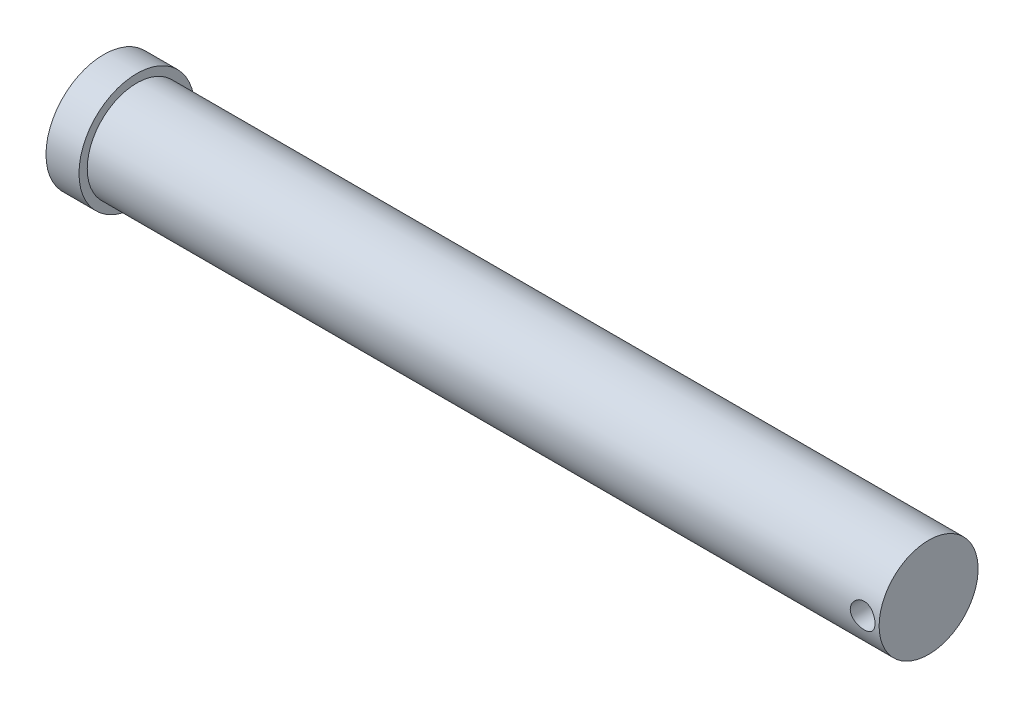
ISO-10303-21;
HEADER;
FILE_DESCRIPTION(('STEP AP214'),'2;1');
FILE_NAME('part.step','',(''),(''),'','','');
FILE_SCHEMA(('AUTOMOTIVE_DESIGN { 1 0 10303 214 1 1 1 1 }'));
ENDSEC;
DATA;
#1=APPLICATION_CONTEXT('core data for automotive mechanical design processes');
#2=APPLICATION_PROTOCOL_DEFINITION('international standard','automotive_design',2000,#1);
#3=PRODUCT_CONTEXT('',#1,'mechanical');
#4=PRODUCT('Part','Part','',(#3));
#5=PRODUCT_RELATED_PRODUCT_CATEGORY('part','',(#4));
#6=PRODUCT_DEFINITION_FORMATION('','',#4);
#7=PRODUCT_DEFINITION_CONTEXT('part definition',#1,'design');
#8=PRODUCT_DEFINITION('design','',#6,#7);
#9=PRODUCT_DEFINITION_SHAPE('','',#8);
#10=(LENGTH_UNIT() NAMED_UNIT(*) SI_UNIT(.MILLI.,.METRE.));
#11=(NAMED_UNIT(*) PLANE_ANGLE_UNIT() SI_UNIT($,.RADIAN.));
#12=(NAMED_UNIT(*) SI_UNIT($,.STERADIAN.) SOLID_ANGLE_UNIT());
#13=UNCERTAINTY_MEASURE_WITH_UNIT(LENGTH_MEASURE(1.E-05),#10,'distance_accuracy_value','');
#14=(GEOMETRIC_REPRESENTATION_CONTEXT(3) GLOBAL_UNCERTAINTY_ASSIGNED_CONTEXT((#13)) GLOBAL_UNIT_ASSIGNED_CONTEXT((#10,
#11,#12)) REPRESENTATION_CONTEXT('',''));
#15=CARTESIAN_POINT('',(0.,0.,0.));
#16=DIRECTION('',(0.,0.,1.));
#17=DIRECTION('',(1.,0.,0.));
#18=AXIS2_PLACEMENT_3D('',#15,#16,#17);
#19=CARTESIAN_POINT('',(0.,0.,0.));
#20=DIRECTION('',(1.,0.,0.));
#21=DIRECTION('',(0.,0.,-1.));
#22=AXIS2_PLACEMENT_3D('',#19,#20,#21);
#23=PLANE('',#22);
#24=CARTESIAN_POINT('',(0.,0.,0.));
#25=DIRECTION('',(-1.,0.,0.));
#26=DIRECTION('',(0.,0.,1.));
#27=AXIS2_PLACEMENT_3D('',#24,#25,#26);
#28=CIRCLE('',#27,35.);
#29=CARTESIAN_POINT('',(0.,0.,35.));
#30=VERTEX_POINT('',#29);
#31=EDGE_CURVE('E45',#30,#30,#28,.T.);
#32=ORIENTED_EDGE('',*,*,#31,.T.);
#33=EDGE_LOOP('',(#32));
#34=FACE_BOUND('',#33,.T.);
#35=ADVANCED_FACE('F30',(#34),#23,.F.);
#36=CARTESIAN_POINT('',(0.,0.,0.));
#37=DIRECTION('',(-1.,0.,0.));
#38=DIRECTION('',(0.,0.,1.));
#39=AXIS2_PLACEMENT_3D('',#36,#37,#38);
#40=CYLINDRICAL_SURFACE('',#39,35.);
#41=ORIENTED_EDGE('',*,*,#31,.F.);
#42=EDGE_LOOP('',(#41));
#43=FACE_BOUND('',#42,.T.);
#44=CARTESIAN_POINT('',(20.,0.,0.));
#45=DIRECTION('',(-1.,0.,0.));
#46=DIRECTION('',(0.,0.,1.));
#47=AXIS2_PLACEMENT_3D('',#44,#45,#46);
#48=CIRCLE('',#47,35.);
#49=CARTESIAN_POINT('',(20.,0.,35.));
#50=VERTEX_POINT('',#49);
#51=EDGE_CURVE('E49',#50,#50,#48,.T.);
#52=ORIENTED_EDGE('',*,*,#51,.T.);
#53=EDGE_LOOP('',(#52));
#54=FACE_BOUND('',#53,.T.);
#55=ADVANCED_FACE('F73',(#43,#54),#40,.T.);
#56=CARTESIAN_POINT('',(20.,35.,0.));
#57=DIRECTION('',(-1.,0.,0.));
#58=DIRECTION('',(0.,0.,1.));
#59=AXIS2_PLACEMENT_3D('',#56,#57,#58);
#60=PLANE('',#59);
#61=ORIENTED_EDGE('',*,*,#51,.F.);
#62=EDGE_LOOP('',(#61));
#63=FACE_BOUND('',#62,.T.);
#64=CARTESIAN_POINT('',(20.,0.,0.));
#65=DIRECTION('',(-1.,0.,0.));
#66=DIRECTION('',(0.,0.,1.));
#67=AXIS2_PLACEMENT_3D('',#64,#65,#66);
#68=CIRCLE('',#67,30.);
#69=CARTESIAN_POINT('',(20.,0.,30.));
#70=VERTEX_POINT('',#69);
#71=EDGE_CURVE('E84',#70,#70,#68,.T.);
#72=ORIENTED_EDGE('',*,*,#71,.T.);
#73=EDGE_LOOP('',(#72));
#74=FACE_BOUND('',#73,.T.);
#75=ADVANCED_FACE('F70',(#63,#74),#60,.F.);
#76=CARTESIAN_POINT('',(0.,0.,0.));
#77=DIRECTION('',(-1.,0.,0.));
#78=DIRECTION('',(0.,0.,1.));
#79=AXIS2_PLACEMENT_3D('',#76,#77,#78);
#80=CYLINDRICAL_SURFACE('',#79,30.);
#81=CARTESIAN_POINT('',(497.5,0.,-30.));
#82=CARTESIAN_POINT('',(497.500006186217,0.207256734254574,-30.0000037453459));
#83=CARTESIAN_POINT('',(497.491407656385,0.414445772619032,-29.9978490421554));
#84=CARTESIAN_POINT('',(497.457100172479,0.827372926875369,-29.9892986338407));
#85=CARTESIAN_POINT('',(497.431389266198,1.0331108745179,-29.9829024448411));
#86=CARTESIAN_POINT('',(497.36305535088,1.44164335288554,-29.9660390935064));
#87=CARTESIAN_POINT('',(497.320427095302,1.6444369502421,-29.9555706682773));
#88=CARTESIAN_POINT('',(497.218595090544,2.04566249050755,-29.9308482104685));
#89=CARTESIAN_POINT('',(497.159385232191,2.2440927967297,-29.9165927827403));
#90=CARTESIAN_POINT('',(497.024978510783,2.63482361033414,-29.8847130121074));
#91=CARTESIAN_POINT('',(496.949807291118,2.82713338772061,-29.8670940775137));
#92=CARTESIAN_POINT('',(496.783968260347,3.20473275040713,-29.8289408904844));
#93=CARTESIAN_POINT('',(496.693294723878,3.39001971101988,-29.8084055614329));
#94=CARTESIAN_POINT('',(496.497171832667,3.75222027556639,-29.7649811811595));
#95=CARTESIAN_POINT('',(496.391727896132,3.92913691827915,-29.742092993849));
#96=CARTESIAN_POINT('',(496.166735936979,4.27360568159023,-29.6945540671174));
#97=CARTESIAN_POINT('',(496.047182537647,4.44115419618484,-29.6699026572012));
#98=CARTESIAN_POINT('',(495.792523081933,4.76869838853698,-29.619039181262));
#99=CARTESIAN_POINT('',(495.657174907785,4.92850273427093,-29.5928069564233));
#100=CARTESIAN_POINT('',(495.373571351917,5.23627158512015,-29.5399027992388));
#101=CARTESIAN_POINT('',(495.225310108958,5.38423065457484,-29.5132306717209));
#102=CARTESIAN_POINT('',(494.916888160703,5.66727667516601,-29.4601886439759));
#103=CARTESIAN_POINT('',(494.756726097413,5.80236215327963,-29.4338187786372));
#104=CARTESIAN_POINT('',(494.425632772002,6.05867850940972,-29.3821290110363));
#105=CARTESIAN_POINT('',(494.254706399365,6.1799156083703,-29.3568086406046));
#106=CARTESIAN_POINT('',(493.900431237845,6.40951409930151,-29.3075439341613));
#107=CARTESIAN_POINT('',(493.716932176899,6.51764960185278,-29.2836266449605));
#108=CARTESIAN_POINT('',(493.341230118986,6.71799715274033,-29.2383150093389));
#109=CARTESIAN_POINT('',(493.149030545994,6.81021539751506,-29.2169196821753));
#110=CARTESIAN_POINT('',(492.757145068966,6.97807998690056,-29.1772830300449));
#111=CARTESIAN_POINT('',(492.557457135497,7.05372180053082,-29.1590425677112));
#112=CARTESIAN_POINT('',(492.152161449931,7.18774907819539,-29.1262944152227));
#113=CARTESIAN_POINT('',(491.946556194448,7.24614170611684,-29.111785175751));
#114=CARTESIAN_POINT('',(491.534958657447,7.34423429783448,-29.087191868454));
#115=CARTESIAN_POINT('',(491.329053396646,7.3842790777465,-29.0770264361312));
#116=CARTESIAN_POINT('',(490.914524296797,7.44698381998103,-29.0610302983691));
#117=CARTESIAN_POINT('',(490.705901540208,7.46965050140471,-29.0551979176174));
#118=CARTESIAN_POINT('',(490.287403528923,7.4974248655388,-29.0480434288025));
#119=CARTESIAN_POINT('',(490.077528217797,7.50253175108483,-29.0467215255021));
#120=CARTESIAN_POINT('',(489.658110384037,7.49513850303138,-29.0486301556068));
#121=CARTESIAN_POINT('',(489.448567856817,7.48263861425262,-29.0518606257116));
#122=CARTESIAN_POINT('',(489.036489209476,7.44066443989573,-29.0626386537169));
#123=CARTESIAN_POINT('',(488.833907059313,7.4116127135399,-29.0700787116682));
#124=CARTESIAN_POINT('',(488.431905166734,7.33708950806225,-29.0889771849314));
#125=CARTESIAN_POINT('',(488.232486535232,7.29161238858818,-29.1004369805509));
#126=CARTESIAN_POINT('',(487.838319690164,7.18462456321622,-29.1270356051467));
#127=CARTESIAN_POINT('',(487.643570038699,7.12311886472078,-29.1421732850352));
#128=CARTESIAN_POINT('',(487.259908488116,6.98451980658927,-29.1757016001342));
#129=CARTESIAN_POINT('',(487.070998807608,6.90742060486374,-29.1940934541936));
#130=CARTESIAN_POINT('',(486.69851839304,6.73739848582151,-29.2338015327733));
#131=CARTESIAN_POINT('',(486.515017414975,6.64432902465888,-29.2551444484012));
#132=CARTESIAN_POINT('',(486.156419006921,6.44353389820847,-29.3000247863839));
#133=CARTESIAN_POINT('',(485.981324498637,6.33580318651136,-29.3235629634671));
#134=CARTESIAN_POINT('',(485.640714884194,6.10645448231138,-29.3721798477543));
#135=CARTESIAN_POINT('',(485.475199544114,5.98483682913734,-29.3972585173093));
#136=CARTESIAN_POINT('',(485.154773921606,5.72851464458563,-29.4482799478748));
#137=CARTESIAN_POINT('',(484.999863844413,5.59380986006436,-29.4742227255933));
#138=CARTESIAN_POINT('',(484.697330574703,5.30812720402336,-29.5270296746379));
#139=CARTESIAN_POINT('',(484.550044476872,5.15679305825285,-29.5538989083984));
#140=CARTESIAN_POINT('',(484.268755446213,4.8422451377086,-29.6070614891839));
#141=CARTESIAN_POINT('',(484.134748122933,4.67903532063278,-29.633355024301));
#142=CARTESIAN_POINT('',(483.88082948277,4.34169745900449,-29.6846555639648));
#143=CARTESIAN_POINT('',(483.760923905518,4.16756501268236,-29.7096620423464));
#144=CARTESIAN_POINT('',(483.536173056712,3.80966849400542,-29.7576713903058));
#145=CARTESIAN_POINT('',(483.431321967214,3.62590818010508,-29.7806750325377));
#146=CARTESIAN_POINT('',(483.237034272838,3.24921184124929,-29.8241295151946));
#147=CARTESIAN_POINT('',(483.147658542865,3.05624322556215,-29.8445701905708));
#148=CARTESIAN_POINT('',(482.985552498738,2.6632116427314,-29.8822063507743));
#149=CARTESIAN_POINT('',(482.912816015972,2.46315133653782,-29.8994030378182));
#150=CARTESIAN_POINT('',(482.784544100766,2.05730133669797,-29.9300671893901));
#151=CARTESIAN_POINT('',(482.729009232108,1.85151145550624,-29.9435345316876));
#152=CARTESIAN_POINT('',(482.635622134414,1.43573434643275,-29.9663479171876));
#153=CARTESIAN_POINT('',(482.597769469432,1.22574722216535,-29.9756940619961));
#154=CARTESIAN_POINT('',(482.540819163691,0.808578683807361,-29.9898089145492));
#155=CARTESIAN_POINT('',(482.521266127366,0.601463095698461,-29.9946886976466));
#156=CARTESIAN_POINT('',(482.499432162322,0.186267995157771,-30.0001400772457));
#157=CARTESIAN_POINT('',(482.497150960436,-0.0218115019769025,-30.000711741884));
#158=CARTESIAN_POINT('',(482.50987953381,-0.437389325214032,-29.9975310207239));
#159=CARTESIAN_POINT('',(482.524887864681,-0.644887698412749,-29.9937789961322));
#160=CARTESIAN_POINT('',(482.572063941794,-1.05780268491358,-29.9820565166686));
#161=CARTESIAN_POINT('',(482.604231620946,-1.26321930635195,-29.9740860782903));
#162=CARTESIAN_POINT('',(482.684842366611,-1.66742320422338,-29.9542990466074));
#163=CARTESIAN_POINT('',(482.733033584068,-1.86626371494321,-29.9425420528386));
#164=CARTESIAN_POINT('',(482.845432070167,-2.25918742632009,-29.9154620308896));
#165=CARTESIAN_POINT('',(482.909644760804,-2.45326899198191,-29.9001377955995));
#166=CARTESIAN_POINT('',(483.05356225007,-2.83525089394273,-29.8663374011303));
#167=CARTESIAN_POINT('',(483.133262697368,-3.02315294909719,-29.8478621274231));
#168=CARTESIAN_POINT('',(483.307610064188,-3.39167896910059,-29.8082350586212));
#169=CARTESIAN_POINT('',(483.402262583514,-3.57230017520982,-29.7870822613409));
#170=CARTESIAN_POINT('',(483.607595070583,-3.92811410360474,-29.7422701230095));
#171=CARTESIAN_POINT('',(483.718525064136,-4.10315786453239,-29.7185735994032));
#172=CARTESIAN_POINT('',(483.954405866344,-4.44338343365202,-29.6696123625192));
#173=CARTESIAN_POINT('',(484.07936153279,-4.60856179442647,-29.6443471072734));
#174=CARTESIAN_POINT('',(484.342420940197,-4.92794065130355,-29.5929310301235));
#175=CARTESIAN_POINT('',(484.480524460526,-5.08214133154532,-29.5667802230845));
#176=CARTESIAN_POINT('',(484.76898239741,-5.37858986672454,-29.5142920657744));
#177=CARTESIAN_POINT('',(484.919336952682,-5.52083758628274,-29.4879547133943));
#178=CARTESIAN_POINT('',(485.235205576479,-5.79583124003958,-29.4351563606738));
#179=CARTESIAN_POINT('',(485.401002867936,-5.92825459803295,-29.4087084526847));
#180=CARTESIAN_POINT('',(485.743293990939,-6.17862451598173,-29.3571275246933));
#181=CARTESIAN_POINT('',(485.919784122681,-6.2965760410501,-29.3319940554304));
#182=CARTESIAN_POINT('',(486.282397387657,-6.51724566861915,-29.2837544538572));
#183=CARTESIAN_POINT('',(486.468523885388,-6.61995840151206,-29.2606490373261));
#184=CARTESIAN_POINT('',(486.849007741884,-6.80928641924752,-29.2171705487862));
#185=CARTESIAN_POINT('',(487.043361767825,-6.89590814708463,-29.1967963840713));
#186=CARTESIAN_POINT('',(487.437897915295,-7.05197723932849,-29.1594928518965));
#187=CARTESIAN_POINT('',(487.638041174236,-7.12151832737373,-29.142544780169));
#188=CARTESIAN_POINT('',(488.043683954083,-7.24345651216679,-29.1124764442986));
#189=CARTESIAN_POINT('',(488.249181379846,-7.29586020933087,-29.0993547066657));
#190=CARTESIAN_POINT('',(488.664097517061,-7.38310953761381,-29.0773403452908));
#191=CARTESIAN_POINT('',(488.873516262,-7.41795501871784,-29.0684477576821));
#192=CARTESIAN_POINT('',(489.294693502206,-7.46977632397466,-29.0551744235845));
#193=CARTESIAN_POINT('',(489.506451941057,-7.48675257805307,-29.0507935685455));
#194=CARTESIAN_POINT('',(489.924548037895,-7.50245275501608,-29.0467427280977));
#195=CARTESIAN_POINT('',(490.130865291879,-7.50169050219219,-29.0469401256905));
#196=CARTESIAN_POINT('',(490.542757585411,-7.48317627143568,-29.0517153474306));
#197=CARTESIAN_POINT('',(490.748332344452,-7.46541843430738,-29.0562946822425));
#198=CARTESIAN_POINT('',(491.157102212016,-7.41306667528967,-29.0696950370366));
#199=CARTESIAN_POINT('',(491.360298223325,-7.37847936764756,-29.0785143906083));
#200=CARTESIAN_POINT('',(491.763027411306,-7.29274542738182,-29.1001342961677));
#201=CARTESIAN_POINT('',(491.962559195749,-7.24159263281379,-29.1129363295422));
#202=CARTESIAN_POINT('',(492.355248099114,-7.12352281554545,-29.1420502241293));
#203=CARTESIAN_POINT('',(492.548437627675,-7.05670785633591,-29.1583393045388));
#204=CARTESIAN_POINT('',(492.928538990651,-6.90762983393257,-29.1940151713161));
#205=CARTESIAN_POINT('',(493.115448654799,-6.82536149362097,-29.2134030155311));
#206=CARTESIAN_POINT('',(493.481700975957,-6.64600134575065,-29.2547283332099));
#207=CARTESIAN_POINT('',(493.66104416923,-6.54891059096671,-29.2766656255706));
#208=CARTESIAN_POINT('',(494.011053726098,-6.34057791264133,-29.3224903932774));
#209=CARTESIAN_POINT('',(494.181719851362,-6.2293356006946,-29.3463779221434));
#210=CARTESIAN_POINT('',(494.517676511658,-5.99034243964055,-29.3961065190916));
#211=CARTESIAN_POINT('',(494.682708134733,-5.86223474325166,-29.42198241748));
#212=CARTESIAN_POINT('',(495.001403053256,-5.59280739993018,-29.4743842744133));
#213=CARTESIAN_POINT('',(495.155069946792,-5.45149196693634,-29.5009100236431));
#214=CARTESIAN_POINT('',(495.450186022067,-5.15645532971095,-29.5539073425417));
#215=CARTESIAN_POINT('',(495.591628075763,-5.00272698747202,-29.580378871931));
#216=CARTESIAN_POINT('',(495.861210696173,-4.68398990056899,-29.6325210396486));
#217=CARTESIAN_POINT('',(495.989356069046,-4.51898526780471,-29.6581919649966));
#218=CARTESIAN_POINT('',(496.233778989682,-4.17555233782097,-29.7085076706245));
#219=CARTESIAN_POINT('',(496.349792570839,-3.99693193174419,-29.7331246154161));
#220=CARTESIAN_POINT('',(496.566283371818,-3.63032066972452,-29.7801093561847));
#221=CARTESIAN_POINT('',(496.666766303198,-3.4423332923778,-29.8024779779427));
#222=CARTESIAN_POINT('',(496.851436858964,-3.0582961610557,-29.8443309638024));
#223=CARTESIAN_POINT('',(496.935631507769,-2.86224992693639,-29.8638165703651));
#224=CARTESIAN_POINT('',(497.087082944362,-2.46348752288635,-29.8993536986122));
#225=CARTESIAN_POINT('',(497.154342287269,-2.26077236435612,-29.9154057382819));
#226=CARTESIAN_POINT('',(497.307791067383,-1.72222038090993,-29.9523811960306));
#227=CARTESIAN_POINT('',(497.379744222302,-1.38198934082179,-29.9701268439889));
#228=CARTESIAN_POINT('',(497.475841710173,-0.694441878056045,-29.9939326700618));
#229=CARTESIAN_POINT('',(497.499989638953,-0.347125990274136,-29.9999937270705));
#230=CARTESIAN_POINT('',(497.5,0.,-30.));
#231=B_SPLINE_CURVE_WITH_KNOTS('',3,(#81,#82,#83,#84,#85,#86,#87,#88,#89,#90,#91,#92,#93,#94,
#95,#96,#97,#98,#99,#100,#101,#102,#103,#104,#105,#106,#107,#108,#109,#110,#111,#112,#113,#114,
#115,#116,#117,#118,#119,#120,#121,#122,#123,#124,#125,#126,#127,#128,#129,#130,#131,#132,#133,
#134,#135,#136,#137,#138,#139,#140,#141,#142,#143,#144,#145,#146,#147,#148,#149,#150,#151,#152,
#153,#154,#155,#156,#157,#158,#159,#160,#161,#162,#163,#164,#165,#166,#167,#168,#169,#170,#171,
#172,#173,#174,#175,#176,#177,#178,#179,#180,#181,#182,#183,#184,#185,#186,#187,#188,#189,#190,
#191,#192,#193,#194,#195,#196,#197,#198,#199,#200,#201,#202,#203,#204,#205,#206,#207,#208,#209,
#210,#211,#212,#213,#214,#215,#216,#217,#218,#219,#220,#221,#222,#223,#224,#225,#226,#227,#228,
#229,#230),.UNSPECIFIED.,.T.,.F.,(4,2,2,2,2,2,2,2,2,2,2,2,2,2,2,2,2,2,2,2,2,2,2,2,2,2,2,2,2,2,2,
2,2,2,2,2,2,2,2,2,2,2,2,2,2,2,2,2,2,2,2,2,2,2,2,2,2,2,2,2,2,2,2,2,2,2,2,2,2,2,2,2,2,2,4),(0.,
0.621464317010415,1.24299954382043,1.86472767684075,2.48668517567918,3.10765090273784,
3.72884646419193,4.34981474719269,4.9710204322486,5.60345785394206,6.23618384989137,
6.86898215694612,7.50149507214969,8.14370490718985,8.78566416935039,9.42779868557197,
10.0696661359822,10.6989188565581,11.3279281587942,11.9569660158719,12.5859951263177,
13.1996422302775,13.813500256537,14.4271667401151,15.0410635604956,15.6609283810619,
16.2810071015709,16.9010706736347,17.5211462419403,18.1590318968173,18.7967059344353,
19.4346386236679,20.072324110567,20.7124637031903,21.3523655930574,21.9922884534341,
22.6321955359513,23.2557181786969,23.8792309598844,24.502691655776,25.1261499140133,
25.7402389224971,26.3545360338667,26.9686608054559,27.5830161248213,28.2080518295537,
28.8333046873218,29.4585470546531,30.0837965025262,30.7245311303908,31.3650453114752,
32.0057846536418,32.6462668819265,33.2831519874563,33.9197915088559,34.5564364695181,
35.1930661124366,35.8112783348089,36.4297037614805,37.0478863332832,37.666299118085,
38.2807888234883,38.8954887514427,39.5101450400985,40.1248182023237,40.7556352414597,
41.386251700531,42.0172334122504,42.6479862516883,43.2904290553219,43.9326350288529,
44.5745634267957,45.2163949154786,46.2573388715186,47.2982045265631),.UNSPECIFIED.);
#232=CARTESIAN_POINT('',(497.5,0.,-30.));
#233=VERTEX_POINT('',#232);
#234=EDGE_CURVE('E10',#233,#233,#231,.T.);
#235=ORIENTED_EDGE('',*,*,#234,.T.);
#236=EDGE_LOOP('',(#235));
#237=FACE_BOUND('',#236,.T.);
#238=CARTESIAN_POINT('',(497.5,0.,30.));
#239=CARTESIAN_POINT('',(497.500006186217,-0.207256734254574,30.0000037453459));
#240=CARTESIAN_POINT('',(497.491407656385,-0.414445772619032,29.9978490421554));
#241=CARTESIAN_POINT('',(497.457100172479,-0.827372926875369,29.9892986338407));
#242=CARTESIAN_POINT('',(497.431389266198,-1.0331108745179,29.9829024448411));
#243=CARTESIAN_POINT('',(497.36305535088,-1.44164335288554,29.9660390935064));
#244=CARTESIAN_POINT('',(497.320427095302,-1.6444369502421,29.9555706682773));
#245=CARTESIAN_POINT('',(497.218595090544,-2.04566249050755,29.9308482104685));
#246=CARTESIAN_POINT('',(497.159385232191,-2.2440927967297,29.9165927827403));
#247=CARTESIAN_POINT('',(497.024978510783,-2.63482361033414,29.8847130121074));
#248=CARTESIAN_POINT('',(496.949807291118,-2.82713338772061,29.8670940775137));
#249=CARTESIAN_POINT('',(496.783968260347,-3.20473275040713,29.8289408904844));
#250=CARTESIAN_POINT('',(496.693294723878,-3.39001971101988,29.8084055614329));
#251=CARTESIAN_POINT('',(496.497171832667,-3.75222027556639,29.7649811811595));
#252=CARTESIAN_POINT('',(496.391727896132,-3.92913691827915,29.742092993849));
#253=CARTESIAN_POINT('',(496.166735936979,-4.27360568159023,29.6945540671174));
#254=CARTESIAN_POINT('',(496.047182537647,-4.44115419618484,29.6699026572012));
#255=CARTESIAN_POINT('',(495.792523081933,-4.76869838853698,29.619039181262));
#256=CARTESIAN_POINT('',(495.657174907785,-4.92850273427093,29.5928069564233));
#257=CARTESIAN_POINT('',(495.373571351917,-5.23627158512015,29.5399027992388));
#258=CARTESIAN_POINT('',(495.225310108958,-5.38423065457484,29.5132306717209));
#259=CARTESIAN_POINT('',(494.916888160703,-5.66727667516601,29.4601886439759));
#260=CARTESIAN_POINT('',(494.756726097413,-5.80236215327963,29.4338187786372));
#261=CARTESIAN_POINT('',(494.425632772002,-6.05867850940972,29.3821290110363));
#262=CARTESIAN_POINT('',(494.254706399365,-6.1799156083703,29.3568086406046));
#263=CARTESIAN_POINT('',(493.900431237845,-6.40951409930151,29.3075439341613));
#264=CARTESIAN_POINT('',(493.716932176899,-6.51764960185278,29.2836266449605));
#265=CARTESIAN_POINT('',(493.341230118986,-6.71799715274033,29.2383150093389));
#266=CARTESIAN_POINT('',(493.149030545994,-6.81021539751506,29.2169196821753));
#267=CARTESIAN_POINT('',(492.757145068966,-6.97807998690056,29.1772830300449));
#268=CARTESIAN_POINT('',(492.557457135497,-7.05372180053082,29.1590425677112));
#269=CARTESIAN_POINT('',(492.152161449931,-7.18774907819539,29.1262944152227));
#270=CARTESIAN_POINT('',(491.946556194448,-7.24614170611684,29.111785175751));
#271=CARTESIAN_POINT('',(491.534958657447,-7.34423429783448,29.087191868454));
#272=CARTESIAN_POINT('',(491.329053396646,-7.3842790777465,29.0770264361312));
#273=CARTESIAN_POINT('',(490.914524296797,-7.44698381998103,29.0610302983691));
#274=CARTESIAN_POINT('',(490.705901540208,-7.46965050140471,29.0551979176174));
#275=CARTESIAN_POINT('',(490.287403528923,-7.4974248655388,29.0480434288025));
#276=CARTESIAN_POINT('',(490.077528217797,-7.50253175108483,29.0467215255021));
#277=CARTESIAN_POINT('',(489.658110384037,-7.49513850303138,29.0486301556068));
#278=CARTESIAN_POINT('',(489.448567856817,-7.48263861425262,29.0518606257116));
#279=CARTESIAN_POINT('',(489.036489209476,-7.44066443989573,29.0626386537169));
#280=CARTESIAN_POINT('',(488.833907059313,-7.4116127135399,29.0700787116682));
#281=CARTESIAN_POINT('',(488.431905166734,-7.33708950806225,29.0889771849314));
#282=CARTESIAN_POINT('',(488.232486535232,-7.29161238858818,29.1004369805509));
#283=CARTESIAN_POINT('',(487.838319690164,-7.18462456321622,29.1270356051467));
#284=CARTESIAN_POINT('',(487.643570038699,-7.12311886472078,29.1421732850352));
#285=CARTESIAN_POINT('',(487.259908488116,-6.98451980658927,29.1757016001342));
#286=CARTESIAN_POINT('',(487.070998807608,-6.90742060486374,29.1940934541936));
#287=CARTESIAN_POINT('',(486.69851839304,-6.73739848582151,29.2338015327733));
#288=CARTESIAN_POINT('',(486.515017414975,-6.64432902465888,29.2551444484012));
#289=CARTESIAN_POINT('',(486.156419006921,-6.44353389820847,29.3000247863839));
#290=CARTESIAN_POINT('',(485.981324498637,-6.33580318651136,29.3235629634671));
#291=CARTESIAN_POINT('',(485.640714884194,-6.10645448231138,29.3721798477543));
#292=CARTESIAN_POINT('',(485.475199544114,-5.98483682913734,29.3972585173093));
#293=CARTESIAN_POINT('',(485.154773921606,-5.72851464458563,29.4482799478748));
#294=CARTESIAN_POINT('',(484.999863844413,-5.59380986006436,29.4742227255933));
#295=CARTESIAN_POINT('',(484.697330574703,-5.30812720402336,29.5270296746379));
#296=CARTESIAN_POINT('',(484.550044476872,-5.15679305825285,29.5538989083984));
#297=CARTESIAN_POINT('',(484.268755446213,-4.8422451377086,29.6070614891839));
#298=CARTESIAN_POINT('',(484.134748122933,-4.67903532063278,29.633355024301));
#299=CARTESIAN_POINT('',(483.88082948277,-4.34169745900449,29.6846555639648));
#300=CARTESIAN_POINT('',(483.760923905518,-4.16756501268236,29.7096620423464));
#301=CARTESIAN_POINT('',(483.536173056712,-3.80966849400542,29.7576713903058));
#302=CARTESIAN_POINT('',(483.431321967214,-3.62590818010508,29.7806750325377));
#303=CARTESIAN_POINT('',(483.237034272838,-3.24921184124929,29.8241295151946));
#304=CARTESIAN_POINT('',(483.147658542865,-3.05624322556215,29.8445701905708));
#305=CARTESIAN_POINT('',(482.985552498738,-2.6632116427314,29.8822063507743));
#306=CARTESIAN_POINT('',(482.912816015972,-2.46315133653782,29.8994030378182));
#307=CARTESIAN_POINT('',(482.784544100766,-2.05730133669797,29.9300671893901));
#308=CARTESIAN_POINT('',(482.729009232108,-1.85151145550624,29.9435345316876));
#309=CARTESIAN_POINT('',(482.635622134414,-1.43573434643275,29.9663479171876));
#310=CARTESIAN_POINT('',(482.597769469432,-1.22574722216535,29.9756940619961));
#311=CARTESIAN_POINT('',(482.540819163691,-0.808578683807361,29.9898089145492));
#312=CARTESIAN_POINT('',(482.521266127366,-0.601463095698461,29.9946886976466));
#313=CARTESIAN_POINT('',(482.499432162322,-0.186267995157771,30.0001400772457));
#314=CARTESIAN_POINT('',(482.497150960436,0.0218115019769025,30.000711741884));
#315=CARTESIAN_POINT('',(482.50987953381,0.437389325214032,29.9975310207239));
#316=CARTESIAN_POINT('',(482.524887864681,0.644887698412749,29.9937789961322));
#317=CARTESIAN_POINT('',(482.572063941794,1.05780268491358,29.9820565166686));
#318=CARTESIAN_POINT('',(482.604231620946,1.26321930635195,29.9740860782903));
#319=CARTESIAN_POINT('',(482.684842366611,1.66742320422338,29.9542990466074));
#320=CARTESIAN_POINT('',(482.733033584068,1.86626371494321,29.9425420528386));
#321=CARTESIAN_POINT('',(482.845432070167,2.25918742632009,29.9154620308896));
#322=CARTESIAN_POINT('',(482.909644760804,2.45326899198191,29.9001377955995));
#323=CARTESIAN_POINT('',(483.05356225007,2.83525089394273,29.8663374011303));
#324=CARTESIAN_POINT('',(483.133262697368,3.02315294909719,29.8478621274231));
#325=CARTESIAN_POINT('',(483.307610064188,3.39167896910059,29.8082350586212));
#326=CARTESIAN_POINT('',(483.402262583514,3.57230017520982,29.7870822613409));
#327=CARTESIAN_POINT('',(483.607595070583,3.92811410360474,29.7422701230095));
#328=CARTESIAN_POINT('',(483.718525064136,4.10315786453239,29.7185735994032));
#329=CARTESIAN_POINT('',(483.954405866344,4.44338343365202,29.6696123625192));
#330=CARTESIAN_POINT('',(484.07936153279,4.60856179442647,29.6443471072734));
#331=CARTESIAN_POINT('',(484.342420940197,4.92794065130355,29.5929310301235));
#332=CARTESIAN_POINT('',(484.480524460526,5.08214133154532,29.5667802230845));
#333=CARTESIAN_POINT('',(484.76898239741,5.37858986672454,29.5142920657744));
#334=CARTESIAN_POINT('',(484.919336952682,5.52083758628274,29.4879547133943));
#335=CARTESIAN_POINT('',(485.235205576479,5.79583124003958,29.4351563606738));
#336=CARTESIAN_POINT('',(485.401002867936,5.92825459803295,29.4087084526847));
#337=CARTESIAN_POINT('',(485.743293990939,6.17862451598173,29.3571275246933));
#338=CARTESIAN_POINT('',(485.919784122681,6.2965760410501,29.3319940554304));
#339=CARTESIAN_POINT('',(486.282397387657,6.51724566861915,29.2837544538572));
#340=CARTESIAN_POINT('',(486.468523885388,6.61995840151206,29.2606490373261));
#341=CARTESIAN_POINT('',(486.849007741884,6.80928641924752,29.2171705487862));
#342=CARTESIAN_POINT('',(487.043361767825,6.89590814708463,29.1967963840713));
#343=CARTESIAN_POINT('',(487.437897915295,7.05197723932849,29.1594928518965));
#344=CARTESIAN_POINT('',(487.638041174236,7.12151832737373,29.142544780169));
#345=CARTESIAN_POINT('',(488.043683954083,7.24345651216679,29.1124764442986));
#346=CARTESIAN_POINT('',(488.249181379846,7.29586020933087,29.0993547066657));
#347=CARTESIAN_POINT('',(488.664097517061,7.38310953761381,29.0773403452908));
#348=CARTESIAN_POINT('',(488.873516262,7.41795501871784,29.0684477576821));
#349=CARTESIAN_POINT('',(489.294693502206,7.46977632397466,29.0551744235845));
#350=CARTESIAN_POINT('',(489.506451941057,7.48675257805307,29.0507935685455));
#351=CARTESIAN_POINT('',(489.924548037895,7.50245275501608,29.0467427280977));
#352=CARTESIAN_POINT('',(490.130865291879,7.50169050219219,29.0469401256905));
#353=CARTESIAN_POINT('',(490.542757585411,7.48317627143568,29.0517153474306));
#354=CARTESIAN_POINT('',(490.748332344452,7.46541843430738,29.0562946822425));
#355=CARTESIAN_POINT('',(491.157102212016,7.41306667528967,29.0696950370366));
#356=CARTESIAN_POINT('',(491.360298223325,7.37847936764756,29.0785143906083));
#357=CARTESIAN_POINT('',(491.763027411306,7.29274542738182,29.1001342961677));
#358=CARTESIAN_POINT('',(491.962559195749,7.24159263281379,29.1129363295422));
#359=CARTESIAN_POINT('',(492.355248099114,7.12352281554545,29.1420502241293));
#360=CARTESIAN_POINT('',(492.548437627675,7.05670785633591,29.1583393045388));
#361=CARTESIAN_POINT('',(492.928538990651,6.90762983393257,29.1940151713161));
#362=CARTESIAN_POINT('',(493.115448654799,6.82536149362097,29.2134030155311));
#363=CARTESIAN_POINT('',(493.481700975957,6.64600134575065,29.2547283332099));
#364=CARTESIAN_POINT('',(493.66104416923,6.54891059096671,29.2766656255706));
#365=CARTESIAN_POINT('',(494.011053726098,6.34057791264133,29.3224903932774));
#366=CARTESIAN_POINT('',(494.181719851362,6.2293356006946,29.3463779221434));
#367=CARTESIAN_POINT('',(494.517676511658,5.99034243964055,29.3961065190916));
#368=CARTESIAN_POINT('',(494.682708134733,5.86223474325166,29.42198241748));
#369=CARTESIAN_POINT('',(495.001403053256,5.59280739993018,29.4743842744133));
#370=CARTESIAN_POINT('',(495.155069946792,5.45149196693634,29.5009100236431));
#371=CARTESIAN_POINT('',(495.450186022067,5.15645532971095,29.5539073425417));
#372=CARTESIAN_POINT('',(495.591628075763,5.00272698747202,29.580378871931));
#373=CARTESIAN_POINT('',(495.861210696173,4.68398990056899,29.6325210396486));
#374=CARTESIAN_POINT('',(495.989356069046,4.51898526780471,29.6581919649966));
#375=CARTESIAN_POINT('',(496.233778989682,4.17555233782097,29.7085076706245));
#376=CARTESIAN_POINT('',(496.349792570839,3.99693193174419,29.7331246154161));
#377=CARTESIAN_POINT('',(496.566283371818,3.63032066972452,29.7801093561847));
#378=CARTESIAN_POINT('',(496.666766303198,3.4423332923778,29.8024779779427));
#379=CARTESIAN_POINT('',(496.851436858964,3.0582961610557,29.8443309638024));
#380=CARTESIAN_POINT('',(496.935631507769,2.86224992693639,29.8638165703651));
#381=CARTESIAN_POINT('',(497.087082944362,2.46348752288635,29.8993536986122));
#382=CARTESIAN_POINT('',(497.154342287269,2.26077236435612,29.9154057382819));
#383=CARTESIAN_POINT('',(497.307791067383,1.72222038090993,29.9523811960306));
#384=CARTESIAN_POINT('',(497.379744222302,1.38198934082179,29.9701268439889));
#385=CARTESIAN_POINT('',(497.475841710173,0.694441878056045,29.9939326700618));
#386=CARTESIAN_POINT('',(497.499989638953,0.347125990274136,29.9999937270705));
#387=CARTESIAN_POINT('',(497.5,0.,30.));
#388=B_SPLINE_CURVE_WITH_KNOTS('',3,(#238,#239,#240,#241,#242,#243,#244,#245,#246,#247,#248,
#249,#250,#251,#252,#253,#254,#255,#256,#257,#258,#259,#260,#261,#262,#263,#264,#265,#266,#267,
#268,#269,#270,#271,#272,#273,#274,#275,#276,#277,#278,#279,#280,#281,#282,#283,#284,#285,#286,
#287,#288,#289,#290,#291,#292,#293,#294,#295,#296,#297,#298,#299,#300,#301,#302,#303,#304,#305,
#306,#307,#308,#309,#310,#311,#312,#313,#314,#315,#316,#317,#318,#319,#320,#321,#322,#323,#324,
#325,#326,#327,#328,#329,#330,#331,#332,#333,#334,#335,#336,#337,#338,#339,#340,#341,#342,#343,
#344,#345,#346,#347,#348,#349,#350,#351,#352,#353,#354,#355,#356,#357,#358,#359,#360,#361,#362,
#363,#364,#365,#366,#367,#368,#369,#370,#371,#372,#373,#374,#375,#376,#377,#378,#379,#380,#381,
#382,#383,#384,#385,#386,#387),.UNSPECIFIED.,.T.,.F.,(4,2,2,2,2,2,2,2,2,2,2,2,2,2,2,2,2,2,2,2,2,
2,2,2,2,2,2,2,2,2,2,2,2,2,2,2,2,2,2,2,2,2,2,2,2,2,2,2,2,2,2,2,2,2,2,2,2,2,2,2,2,2,2,2,2,2,2,2,2,
2,2,2,2,2,4),(0.,0.621464317010415,1.24299954382043,1.86472767684075,2.48668517567918,
3.10765090273784,3.72884646419193,4.34981474719269,4.9710204322486,5.60345785394206,
6.23618384989137,6.86898215694612,7.50149507214969,8.14370490718985,8.78566416935039,
9.42779868557197,10.0696661359822,10.6989188565581,11.3279281587942,11.9569660158719,
12.5859951263177,13.1996422302775,13.813500256537,14.4271667401151,15.0410635604956,
15.6609283810619,16.2810071015709,16.9010706736347,17.5211462419403,18.1590318968173,
18.7967059344353,19.4346386236679,20.072324110567,20.7124637031903,21.3523655930574,
21.9922884534341,22.6321955359513,23.2557181786969,23.8792309598844,24.502691655776,
25.1261499140133,25.7402389224971,26.3545360338667,26.9686608054559,27.5830161248213,
28.2080518295537,28.8333046873218,29.4585470546531,30.0837965025262,30.7245311303908,
31.3650453114752,32.0057846536418,32.6462668819265,33.2831519874563,33.9197915088559,
34.5564364695181,35.1930661124366,35.8112783348089,36.4297037614805,37.0478863332832,
37.666299118085,38.2807888234883,38.8954887514427,39.5101450400985,40.1248182023237,
40.7556352414597,41.386251700531,42.0172334122504,42.6479862516883,43.2904290553219,
43.9326350288529,44.5745634267957,45.2163949154786,46.2573388715186,47.2982045265631),.UNSPECIFIED.);
#389=CARTESIAN_POINT('',(497.5,0.,30.));
#390=VERTEX_POINT('',#389);
#391=EDGE_CURVE('E41',#390,#390,#388,.T.);
#392=ORIENTED_EDGE('',*,*,#391,.T.);
#393=EDGE_LOOP('',(#392));
#394=FACE_BOUND('',#393,.T.);
#395=ORIENTED_EDGE('',*,*,#71,.F.);
#396=EDGE_LOOP('',(#395));
#397=FACE_BOUND('',#396,.T.);
#398=CARTESIAN_POINT('',(500.,0.,0.));
#399=DIRECTION('',(-1.,0.,0.));
#400=DIRECTION('',(0.,0.,1.));
#401=AXIS2_PLACEMENT_3D('',#398,#399,#400);
#402=CIRCLE('',#401,30.);
#403=CARTESIAN_POINT('',(500.,0.,30.));
#404=VERTEX_POINT('',#403);
#405=EDGE_CURVE('E86',#404,#404,#402,.T.);
#406=ORIENTED_EDGE('',*,*,#405,.T.);
#407=EDGE_LOOP('',(#406));
#408=FACE_BOUND('',#407,.T.);
#409=ADVANCED_FACE('F55',(#237,#394,#397,#408),#80,.T.);
#410=CARTESIAN_POINT('',(500.,30.,0.));
#411=DIRECTION('',(-1.,0.,0.));
#412=DIRECTION('',(0.,0.,1.));
#413=AXIS2_PLACEMENT_3D('',#410,#411,#412);
#414=PLANE('',#413);
#415=ORIENTED_EDGE('',*,*,#405,.F.);
#416=EDGE_LOOP('',(#415));
#417=FACE_BOUND('',#416,.T.);
#418=ADVANCED_FACE('F62',(#417),#414,.F.);
#419=CARTESIAN_POINT('',(490.,0.,-30.));
#420=DIRECTION('',(0.,0.,1.));
#421=DIRECTION('',(1.,0.,0.));
#422=AXIS2_PLACEMENT_3D('',#419,#420,#421);
#423=CYLINDRICAL_SURFACE('',#422,7.50000000000001);
#424=ORIENTED_EDGE('',*,*,#391,.F.);
#425=EDGE_LOOP('',(#424));
#426=FACE_BOUND('',#425,.T.);
#427=ORIENTED_EDGE('',*,*,#234,.F.);
#428=EDGE_LOOP('',(#427));
#429=FACE_BOUND('',#428,.T.);
#430=ADVANCED_FACE('F59',(#426,#429),#423,.F.);
#431=CLOSED_SHELL('',(#35,#55,#75,#409,#418,#430));
#432=MANIFOLD_SOLID_BREP('B2',#431);
#433=ADVANCED_BREP_SHAPE_REPRESENTATION('',(#18,#432),#14);
#434=SHAPE_DEFINITION_REPRESENTATION(#9,#433);
ENDSEC;
END-ISO-10303-21;
